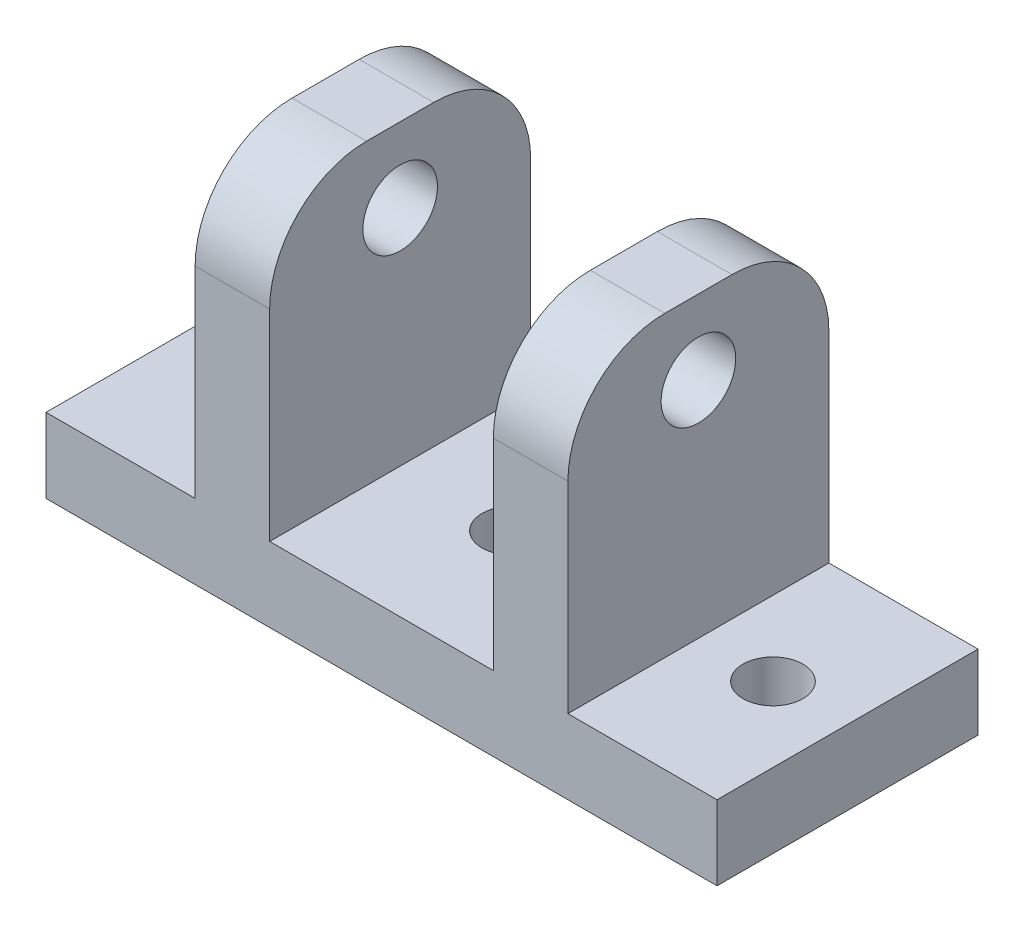
ISO-10303-21;
HEADER;
FILE_DESCRIPTION(('STEP AP214'),'2;1');
FILE_NAME('part.step','',(''),(''),'','','');
FILE_SCHEMA(('AUTOMOTIVE_DESIGN { 1 0 10303 214 1 1 1 1 }'));
ENDSEC;
DATA;
#1=APPLICATION_CONTEXT('core data for automotive mechanical design processes');
#2=APPLICATION_PROTOCOL_DEFINITION('international standard','automotive_design',2000,#1);
#3=PRODUCT_CONTEXT('',#1,'mechanical');
#4=PRODUCT('Part','Part','',(#3));
#5=PRODUCT_RELATED_PRODUCT_CATEGORY('part','',(#4));
#6=PRODUCT_DEFINITION_FORMATION('','',#4);
#7=PRODUCT_DEFINITION_CONTEXT('part definition',#1,'design');
#8=PRODUCT_DEFINITION('design','',#6,#7);
#9=PRODUCT_DEFINITION_SHAPE('','',#8);
#10=(LENGTH_UNIT() NAMED_UNIT(*) SI_UNIT(.MILLI.,.METRE.));
#11=(NAMED_UNIT(*) PLANE_ANGLE_UNIT() SI_UNIT($,.RADIAN.));
#12=(NAMED_UNIT(*) SI_UNIT($,.STERADIAN.) SOLID_ANGLE_UNIT());
#13=UNCERTAINTY_MEASURE_WITH_UNIT(LENGTH_MEASURE(1.E-05),#10,'distance_accuracy_value','');
#14=(GEOMETRIC_REPRESENTATION_CONTEXT(3) GLOBAL_UNCERTAINTY_ASSIGNED_CONTEXT((#13)) GLOBAL_UNIT_ASSIGNED_CONTEXT((#10,
#11,#12)) REPRESENTATION_CONTEXT('',''));
#15=CARTESIAN_POINT('',(0.,0.,0.));
#16=DIRECTION('',(0.,0.,1.));
#17=DIRECTION('',(1.,0.,0.));
#18=AXIS2_PLACEMENT_3D('',#15,#16,#17);
#19=CARTESIAN_POINT('',(0.,6.35,-22.225));
#20=DIRECTION('',(0.,0.,-1.));
#21=DIRECTION('',(-1.,0.,0.));
#22=AXIS2_PLACEMENT_3D('',#19,#20,#21);
#23=PLANE('',#22);
#24=DIRECTION('',(0.,-1.,0.));
#25=VECTOR('',#24,1.);
#26=CARTESIAN_POINT('',(12.7,31.75,-22.225));
#27=LINE('',#26,#25);
#28=CARTESIAN_POINT('',(12.7,23.495,-22.225));
#29=VERTEX_POINT('',#28);
#30=CARTESIAN_POINT('',(12.7,6.35,-22.225));
#31=VERTEX_POINT('',#30);
#32=EDGE_CURVE('E199',#29,#31,#27,.T.);
#33=ORIENTED_EDGE('',*,*,#32,.F.);
#34=DIRECTION('',(1.,0.,0.));
#35=VECTOR('',#34,1.);
#36=CARTESIAN_POINT('',(0.,23.495,-22.225));
#37=LINE('',#36,#35);
#38=CARTESIAN_POINT('',(19.05,23.495,-22.225));
#39=VERTEX_POINT('',#38);
#40=EDGE_CURVE('E260',#29,#39,#37,.T.);
#41=ORIENTED_EDGE('',*,*,#40,.T.);
#42=DIRECTION('',(0.,-1.,0.));
#43=VECTOR('',#42,1.);
#44=CARTESIAN_POINT('',(19.05,31.75,-22.225));
#45=LINE('',#44,#43);
#46=CARTESIAN_POINT('',(19.05,6.35,-22.225));
#47=VERTEX_POINT('',#46);
#48=EDGE_CURVE('E202',#39,#47,#45,.T.);
#49=ORIENTED_EDGE('',*,*,#48,.T.);
#50=DIRECTION('',(1.,0.,0.));
#51=VECTOR('',#50,1.);
#52=CARTESIAN_POINT('',(0.,6.35,-22.225));
#53=LINE('',#52,#51);
#54=CARTESIAN_POINT('',(38.1,6.35,-22.225));
#55=VERTEX_POINT('',#54);
#56=EDGE_CURVE('E243',#47,#55,#53,.T.);
#57=ORIENTED_EDGE('',*,*,#56,.T.);
#58=DIRECTION('',(0.,-1.,0.));
#59=VECTOR('',#58,1.);
#60=CARTESIAN_POINT('',(38.1,31.75,-22.225));
#61=LINE('',#60,#59);
#62=CARTESIAN_POINT('',(38.1,23.495,-22.225));
#63=VERTEX_POINT('',#62);
#64=EDGE_CURVE('E288',#63,#55,#61,.T.);
#65=ORIENTED_EDGE('',*,*,#64,.F.);
#66=DIRECTION('',(1.,0.,0.));
#67=VECTOR('',#66,1.);
#68=CARTESIAN_POINT('',(0.,23.495,-22.225));
#69=LINE('',#68,#67);
#70=CARTESIAN_POINT('',(44.45,23.495,-22.225));
#71=VERTEX_POINT('',#70);
#72=EDGE_CURVE('E321',#63,#71,#69,.T.);
#73=ORIENTED_EDGE('',*,*,#72,.T.);
#74=DIRECTION('',(0.,-1.,0.));
#75=VECTOR('',#74,1.);
#76=CARTESIAN_POINT('',(44.45,31.75,-22.225));
#77=LINE('',#76,#75);
#78=CARTESIAN_POINT('',(44.45,6.35,-22.225));
#79=VERTEX_POINT('',#78);
#80=EDGE_CURVE('E326',#71,#79,#77,.T.);
#81=ORIENTED_EDGE('',*,*,#80,.T.);
#82=DIRECTION('',(1.,0.,0.));
#83=VECTOR('',#82,1.);
#84=CARTESIAN_POINT('',(0.,6.35,-22.225));
#85=LINE('',#84,#83);
#86=CARTESIAN_POINT('',(57.15,6.35,-22.225));
#87=VERTEX_POINT('',#86);
#88=EDGE_CURVE('E166',#79,#87,#85,.T.);
#89=ORIENTED_EDGE('',*,*,#88,.T.);
#90=DIRECTION('',(0.,-1.,0.));
#91=VECTOR('',#90,1.);
#92=CARTESIAN_POINT('',(57.15,6.35,-22.225));
#93=LINE('',#92,#91);
#94=CARTESIAN_POINT('',(57.15,0.,-22.225));
#95=VERTEX_POINT('',#94);
#96=EDGE_CURVE('E174',#87,#95,#93,.T.);
#97=ORIENTED_EDGE('',*,*,#96,.T.);
#98=DIRECTION('',(1.,0.,0.));
#99=VECTOR('',#98,1.);
#100=CARTESIAN_POINT('',(0.,0.,-22.225));
#101=LINE('',#100,#99);
#102=CARTESIAN_POINT('',(0.,0.,-22.225));
#103=VERTEX_POINT('',#102);
#104=EDGE_CURVE('E219',#103,#95,#101,.T.);
#105=ORIENTED_EDGE('',*,*,#104,.F.);
#106=DIRECTION('',(0.,-1.,0.));
#107=VECTOR('',#106,1.);
#108=CARTESIAN_POINT('',(0.,6.35,-22.225));
#109=LINE('',#108,#107);
#110=CARTESIAN_POINT('',(0.,6.35,-22.225));
#111=VERTEX_POINT('',#110);
#112=EDGE_CURVE('E227',#111,#103,#109,.T.);
#113=ORIENTED_EDGE('',*,*,#112,.F.);
#114=DIRECTION('',(1.,0.,0.));
#115=VECTOR('',#114,1.);
#116=CARTESIAN_POINT('',(0.,6.35,-22.225));
#117=LINE('',#116,#115);
#118=EDGE_CURVE('E216',#111,#31,#117,.T.);
#119=ORIENTED_EDGE('',*,*,#118,.T.);
#120=EDGE_LOOP('',(#33,#41,#49,#57,#65,#73,#81,#89,#97,#105,#113,#119));
#121=FACE_BOUND('',#120,.T.);
#122=ADVANCED_FACE('F37',(#121),#23,.T.);
#123=CARTESIAN_POINT('',(0.,6.35,0.));
#124=DIRECTION('',(-1.,0.,0.));
#125=DIRECTION('',(0.,0.,1.));
#126=AXIS2_PLACEMENT_3D('',#123,#124,#125);
#127=PLANE('',#126);
#128=DIRECTION('',(0.,0.,-1.));
#129=VECTOR('',#128,1.);
#130=CARTESIAN_POINT('',(0.,0.,0.));
#131=LINE('',#130,#129);
#132=CARTESIAN_POINT('',(0.,0.,0.));
#133=VERTEX_POINT('',#132);
#134=EDGE_CURVE('E442',#133,#103,#131,.T.);
#135=ORIENTED_EDGE('',*,*,#134,.F.);
#136=DIRECTION('',(0.,-1.,0.));
#137=VECTOR('',#136,1.);
#138=CARTESIAN_POINT('',(0.,6.35,0.));
#139=LINE('',#138,#137);
#140=CARTESIAN_POINT('',(0.,6.35,0.));
#141=VERTEX_POINT('',#140);
#142=EDGE_CURVE('E226',#141,#133,#139,.T.);
#143=ORIENTED_EDGE('',*,*,#142,.F.);
#144=DIRECTION('',(0.,0.,-1.));
#145=VECTOR('',#144,1.);
#146=CARTESIAN_POINT('',(0.,6.35,0.));
#147=LINE('',#146,#145);
#148=EDGE_CURVE('E212',#141,#111,#147,.T.);
#149=ORIENTED_EDGE('',*,*,#148,.T.);
#150=ORIENTED_EDGE('',*,*,#112,.T.);
#151=EDGE_LOOP('',(#135,#143,#149,#150));
#152=FACE_BOUND('',#151,.T.);
#153=ADVANCED_FACE('F363',(#152),#127,.T.);
#154=CARTESIAN_POINT('',(0.,6.35,0.));
#155=DIRECTION('',(0.,0.,-1.));
#156=DIRECTION('',(-1.,0.,0.));
#157=AXIS2_PLACEMENT_3D('',#154,#155,#156);
#158=PLANE('',#157);
#159=DIRECTION('',(0.,-1.,0.));
#160=VECTOR('',#159,1.);
#161=CARTESIAN_POINT('',(44.45,31.75,0.));
#162=LINE('',#161,#160);
#163=CARTESIAN_POINT('',(44.45,23.495,0.));
#164=VERTEX_POINT('',#163);
#165=CARTESIAN_POINT('',(44.45,6.35,0.));
#166=VERTEX_POINT('',#165);
#167=EDGE_CURVE('E149',#164,#166,#162,.T.);
#168=ORIENTED_EDGE('',*,*,#167,.F.);
#169=DIRECTION('',(1.,0.,0.));
#170=VECTOR('',#169,1.);
#171=CARTESIAN_POINT('',(38.1,23.495,0.));
#172=LINE('',#171,#170);
#173=CARTESIAN_POINT('',(38.1,23.495,0.));
#174=VERTEX_POINT('',#173);
#175=EDGE_CURVE('E11',#164,#174,#172,.F.);
#176=ORIENTED_EDGE('',*,*,#175,.T.);
#177=DIRECTION('',(0.,-1.,0.));
#178=VECTOR('',#177,1.);
#179=CARTESIAN_POINT('',(38.1,31.75,0.));
#180=LINE('',#179,#178);
#181=CARTESIAN_POINT('',(38.1,6.35,0.));
#182=VERTEX_POINT('',#181);
#183=EDGE_CURVE('E158',#174,#182,#180,.T.);
#184=ORIENTED_EDGE('',*,*,#183,.T.);
#185=DIRECTION('',(1.,0.,0.));
#186=VECTOR('',#185,1.);
#187=CARTESIAN_POINT('',(0.,6.35,0.));
#188=LINE('',#187,#186);
#189=CARTESIAN_POINT('',(19.05,6.35,0.));
#190=VERTEX_POINT('',#189);
#191=EDGE_CURVE('E242',#190,#182,#188,.T.);
#192=ORIENTED_EDGE('',*,*,#191,.F.);
#193=DIRECTION('',(0.,-1.,0.));
#194=VECTOR('',#193,1.);
#195=CARTESIAN_POINT('',(19.05,31.75,0.));
#196=LINE('',#195,#194);
#197=CARTESIAN_POINT('',(19.05,23.495,0.));
#198=VERTEX_POINT('',#197);
#199=EDGE_CURVE('E255',#198,#190,#196,.T.);
#200=ORIENTED_EDGE('',*,*,#199,.F.);
#201=DIRECTION('',(1.,0.,0.));
#202=VECTOR('',#201,1.);
#203=CARTESIAN_POINT('',(12.7,23.495,0.));
#204=LINE('',#203,#202);
#205=CARTESIAN_POINT('',(12.7,23.495,0.));
#206=VERTEX_POINT('',#205);
#207=EDGE_CURVE('E45',#198,#206,#204,.F.);
#208=ORIENTED_EDGE('',*,*,#207,.T.);
#209=DIRECTION('',(0.,-1.,0.));
#210=VECTOR('',#209,1.);
#211=CARTESIAN_POINT('',(12.7,31.75,0.));
#212=LINE('',#211,#210);
#213=CARTESIAN_POINT('',(12.7,6.35,0.));
#214=VERTEX_POINT('',#213);
#215=EDGE_CURVE('E203',#206,#214,#212,.T.);
#216=ORIENTED_EDGE('',*,*,#215,.T.);
#217=DIRECTION('',(1.,0.,0.));
#218=VECTOR('',#217,1.);
#219=CARTESIAN_POINT('',(0.,6.35,0.));
#220=LINE('',#219,#218);
#221=EDGE_CURVE('E215',#141,#214,#220,.T.);
#222=ORIENTED_EDGE('',*,*,#221,.F.);
#223=ORIENTED_EDGE('',*,*,#142,.T.);
#224=DIRECTION('',(1.,0.,0.));
#225=VECTOR('',#224,1.);
#226=CARTESIAN_POINT('',(0.,0.,0.));
#227=LINE('',#226,#225);
#228=CARTESIAN_POINT('',(57.15,0.,0.));
#229=VERTEX_POINT('',#228);
#230=EDGE_CURVE('E235',#133,#229,#227,.T.);
#231=ORIENTED_EDGE('',*,*,#230,.T.);
#232=DIRECTION('',(0.,-1.,0.));
#233=VECTOR('',#232,1.);
#234=CARTESIAN_POINT('',(57.15,6.35,0.));
#235=LINE('',#234,#233);
#236=CARTESIAN_POINT('',(57.15,6.35,0.));
#237=VERTEX_POINT('',#236);
#238=EDGE_CURVE('E170',#237,#229,#235,.T.);
#239=ORIENTED_EDGE('',*,*,#238,.F.);
#240=DIRECTION('',(1.,0.,0.));
#241=VECTOR('',#240,1.);
#242=CARTESIAN_POINT('',(0.,6.35,0.));
#243=LINE('',#242,#241);
#244=EDGE_CURVE('E163',#166,#237,#243,.T.);
#245=ORIENTED_EDGE('',*,*,#244,.F.);
#246=EDGE_LOOP('',(#168,#176,#184,#192,#200,#208,#216,#222,#223,#231,#239,#245));
#247=FACE_BOUND('',#246,.T.);
#248=ADVANCED_FACE('F168',(#247),#158,.F.);
#249=CARTESIAN_POINT('',(0.,6.35,0.));
#250=DIRECTION('',(0.,1.,0.));
#251=DIRECTION('',(0.,0.,1.));
#252=AXIS2_PLACEMENT_3D('',#249,#250,#251);
#253=PLANE('',#252);
#254=CARTESIAN_POINT('',(6.35,6.35,-11.1125));
#255=DIRECTION('',(0.,1.,0.));
#256=DIRECTION('',(0.,0.,1.));
#257=AXIS2_PLACEMENT_3D('',#254,#255,#256);
#258=CIRCLE('',#257,2.55269999999999);
#259=CARTESIAN_POINT('',(6.35,6.35,-8.55980000000001));
#260=VERTEX_POINT('',#259);
#261=EDGE_CURVE('E198',#260,#260,#258,.T.);
#262=ORIENTED_EDGE('',*,*,#261,.F.);
#263=EDGE_LOOP('',(#262));
#264=FACE_BOUND('',#263,.T.);
#265=ORIENTED_EDGE('',*,*,#118,.F.);
#266=ORIENTED_EDGE('',*,*,#148,.F.);
#267=ORIENTED_EDGE('',*,*,#221,.T.);
#268=DIRECTION('',(0.,0.,1.));
#269=VECTOR('',#268,1.);
#270=CARTESIAN_POINT('',(12.7,6.35,0.));
#271=LINE('',#270,#269);
#272=EDGE_CURVE('E222',#31,#214,#271,.T.);
#273=ORIENTED_EDGE('',*,*,#272,.F.);
#274=EDGE_LOOP('',(#265,#266,#267,#273));
#275=FACE_BOUND('',#274,.T.);
#276=ADVANCED_FACE('F373',(#264,#275),#253,.T.);
#277=CARTESIAN_POINT('',(0.,0.,0.));
#278=DIRECTION('',(0.,1.,0.));
#279=DIRECTION('',(0.,0.,1.));
#280=AXIS2_PLACEMENT_3D('',#277,#278,#279);
#281=PLANE('',#280);
#282=CARTESIAN_POINT('',(6.35,0.,-11.1125));
#283=DIRECTION('',(0.,1.,0.));
#284=DIRECTION('',(0.,0.,1.));
#285=AXIS2_PLACEMENT_3D('',#282,#283,#284);
#286=CIRCLE('',#285,2.55269999999999);
#287=CARTESIAN_POINT('',(6.35,0.,-8.55980000000001));
#288=VERTEX_POINT('',#287);
#289=EDGE_CURVE('E195',#288,#288,#286,.T.);
#290=ORIENTED_EDGE('',*,*,#289,.T.);
#291=EDGE_LOOP('',(#290));
#292=FACE_BOUND('',#291,.T.);
#293=CARTESIAN_POINT('',(28.575,0.,-11.1125));
#294=DIRECTION('',(0.,1.,0.));
#295=DIRECTION('',(0.,0.,1.));
#296=AXIS2_PLACEMENT_3D('',#293,#294,#295);
#297=CIRCLE('',#296,2.55269999999999);
#298=CARTESIAN_POINT('',(28.575,0.,-8.55980000000001));
#299=VERTEX_POINT('',#298);
#300=EDGE_CURVE('E190',#299,#299,#297,.T.);
#301=ORIENTED_EDGE('',*,*,#300,.T.);
#302=EDGE_LOOP('',(#301));
#303=FACE_BOUND('',#302,.T.);
#304=CARTESIAN_POINT('',(50.8,0.,-11.1125));
#305=DIRECTION('',(0.,1.,0.));
#306=DIRECTION('',(0.,0.,1.));
#307=AXIS2_PLACEMENT_3D('',#304,#305,#306);
#308=CIRCLE('',#307,2.55269999999999);
#309=CARTESIAN_POINT('',(50.8,0.,-8.55980000000001));
#310=VERTEX_POINT('',#309);
#311=EDGE_CURVE('E434',#310,#310,#308,.T.);
#312=ORIENTED_EDGE('',*,*,#311,.T.);
#313=EDGE_LOOP('',(#312));
#314=FACE_BOUND('',#313,.T.);
#315=ORIENTED_EDGE('',*,*,#104,.T.);
#316=DIRECTION('',(0.,0.,-1.));
#317=VECTOR('',#316,1.);
#318=CARTESIAN_POINT('',(57.15,0.,0.));
#319=LINE('',#318,#317);
#320=EDGE_CURVE('E182',#229,#95,#319,.T.);
#321=ORIENTED_EDGE('',*,*,#320,.F.);
#322=ORIENTED_EDGE('',*,*,#230,.F.);
#323=ORIENTED_EDGE('',*,*,#134,.T.);
#324=EDGE_LOOP('',(#315,#321,#322,#323));
#325=FACE_BOUND('',#324,.T.);
#326=ADVANCED_FACE('F374',(#292,#303,#314,#325),#281,.F.);
#327=CARTESIAN_POINT('',(12.7,31.75,0.));
#328=DIRECTION('',(1.,0.,0.));
#329=DIRECTION('',(0.,0.,-1.));
#330=AXIS2_PLACEMENT_3D('',#327,#328,#329);
#331=PLANE('',#330);
#332=CARTESIAN_POINT('',(12.7,25.4,-11.1125));
#333=DIRECTION('',(-1.,0.,0.));
#334=DIRECTION('',(0.,0.,1.));
#335=AXIS2_PLACEMENT_3D('',#332,#333,#334);
#336=CIRCLE('',#335,3.175);
#337=CARTESIAN_POINT('',(12.7,25.4,-7.9375));
#338=VERTEX_POINT('',#337);
#339=EDGE_CURVE('E189',#338,#338,#336,.T.);
#340=ORIENTED_EDGE('',*,*,#339,.F.);
#341=EDGE_LOOP('',(#340));
#342=FACE_BOUND('',#341,.T.);
#343=DIRECTION('',(0.,0.,1.));
#344=VECTOR('',#343,1.);
#345=CARTESIAN_POINT('',(12.7,31.75,0.));
#346=LINE('',#345,#344);
#347=CARTESIAN_POINT('',(12.7,31.75,-13.97));
#348=VERTEX_POINT('',#347);
#349=CARTESIAN_POINT('',(12.7,31.75,-8.255));
#350=VERTEX_POINT('',#349);
#351=EDGE_CURVE('E253',#348,#350,#346,.T.);
#352=ORIENTED_EDGE('',*,*,#351,.F.);
#353=CARTESIAN_POINT('',(12.7,23.495,-13.97));
#354=DIRECTION('',(1.,0.,0.));
#355=DIRECTION('',(0.,0.,-1.));
#356=AXIS2_PLACEMENT_3D('',#353,#354,#355);
#357=CIRCLE('',#356,8.255);
#358=EDGE_CURVE('E274',#348,#29,#357,.F.);
#359=ORIENTED_EDGE('',*,*,#358,.T.);
#360=ORIENTED_EDGE('',*,*,#32,.T.);
#361=ORIENTED_EDGE('',*,*,#272,.T.);
#362=ORIENTED_EDGE('',*,*,#215,.F.);
#363=CARTESIAN_POINT('',(12.7,23.495,-8.255));
#364=DIRECTION('',(1.,0.,0.));
#365=DIRECTION('',(0.,0.,-1.));
#366=AXIS2_PLACEMENT_3D('',#363,#364,#365);
#367=CIRCLE('',#366,8.255);
#368=EDGE_CURVE('E271',#206,#350,#367,.F.);
#369=ORIENTED_EDGE('',*,*,#368,.T.);
#370=EDGE_LOOP('',(#352,#359,#360,#361,#362,#369));
#371=FACE_BOUND('',#370,.T.);
#372=ADVANCED_FACE('F302',(#342,#371),#331,.F.);
#373=CARTESIAN_POINT('',(19.05,31.75,0.));
#374=DIRECTION('',(1.,0.,0.));
#375=DIRECTION('',(0.,0.,-1.));
#376=AXIS2_PLACEMENT_3D('',#373,#374,#375);
#377=PLANE('',#376);
#378=CARTESIAN_POINT('',(19.05,25.4,-11.1125));
#379=DIRECTION('',(1.,0.,0.));
#380=DIRECTION('',(0.,0.,-1.));
#381=AXIS2_PLACEMENT_3D('',#378,#379,#380);
#382=CIRCLE('',#381,3.175);
#383=CARTESIAN_POINT('',(19.05,25.4,-14.2875));
#384=VERTEX_POINT('',#383);
#385=EDGE_CURVE('E445',#384,#384,#382,.T.);
#386=ORIENTED_EDGE('',*,*,#385,.F.);
#387=EDGE_LOOP('',(#386));
#388=FACE_BOUND('',#387,.T.);
#389=ORIENTED_EDGE('',*,*,#48,.F.);
#390=CARTESIAN_POINT('',(19.05,23.495,-13.97));
#391=DIRECTION('',(1.,0.,0.));
#392=DIRECTION('',(0.,0.,-1.));
#393=AXIS2_PLACEMENT_3D('',#390,#391,#392);
#394=CIRCLE('',#393,8.255);
#395=CARTESIAN_POINT('',(19.05,31.75,-13.97));
#396=VERTEX_POINT('',#395);
#397=EDGE_CURVE('E264',#39,#396,#394,.T.);
#398=ORIENTED_EDGE('',*,*,#397,.T.);
#399=DIRECTION('',(0.,0.,1.));
#400=VECTOR('',#399,1.);
#401=CARTESIAN_POINT('',(19.05,31.75,0.));
#402=LINE('',#401,#400);
#403=CARTESIAN_POINT('',(19.05,31.75,-8.255));
#404=VERTEX_POINT('',#403);
#405=EDGE_CURVE('E250',#396,#404,#402,.T.);
#406=ORIENTED_EDGE('',*,*,#405,.T.);
#407=CARTESIAN_POINT('',(19.05,23.495,-8.255));
#408=DIRECTION('',(1.,0.,0.));
#409=DIRECTION('',(0.,0.,-1.));
#410=AXIS2_PLACEMENT_3D('',#407,#408,#409);
#411=CIRCLE('',#410,8.255);
#412=EDGE_CURVE('E262',#404,#198,#411,.T.);
#413=ORIENTED_EDGE('',*,*,#412,.T.);
#414=ORIENTED_EDGE('',*,*,#199,.T.);
#415=DIRECTION('',(0.,0.,1.));
#416=VECTOR('',#415,1.);
#417=CARTESIAN_POINT('',(19.05,6.35,0.));
#418=LINE('',#417,#416);
#419=EDGE_CURVE('E238',#47,#190,#418,.T.);
#420=ORIENTED_EDGE('',*,*,#419,.F.);
#421=EDGE_LOOP('',(#389,#398,#406,#413,#414,#420));
#422=FACE_BOUND('',#421,.T.);
#423=ADVANCED_FACE('F311',(#388,#422),#377,.T.);
#424=CARTESIAN_POINT('',(0.,31.75,0.));
#425=DIRECTION('',(0.,1.,0.));
#426=DIRECTION('',(0.,0.,1.));
#427=AXIS2_PLACEMENT_3D('',#424,#425,#426);
#428=PLANE('',#427);
#429=ORIENTED_EDGE('',*,*,#405,.F.);
#430=DIRECTION('',(1.,0.,0.));
#431=VECTOR('',#430,1.);
#432=CARTESIAN_POINT('',(0.,31.75,-13.97));
#433=LINE('',#432,#431);
#434=EDGE_CURVE('E269',#396,#348,#433,.F.);
#435=ORIENTED_EDGE('',*,*,#434,.T.);
#436=ORIENTED_EDGE('',*,*,#351,.T.);
#437=DIRECTION('',(1.,0.,0.));
#438=VECTOR('',#437,1.);
#439=CARTESIAN_POINT('',(19.05,31.75,-8.255));
#440=LINE('',#439,#438);
#441=EDGE_CURVE('E266',#350,#404,#440,.T.);
#442=ORIENTED_EDGE('',*,*,#441,.T.);
#443=EDGE_LOOP('',(#429,#435,#436,#442));
#444=FACE_BOUND('',#443,.T.);
#445=ADVANCED_FACE('F307',(#444),#428,.T.);
#446=CARTESIAN_POINT('',(0.,6.35,0.));
#447=DIRECTION('',(0.,1.,0.));
#448=DIRECTION('',(0.,0.,1.));
#449=AXIS2_PLACEMENT_3D('',#446,#447,#448);
#450=PLANE('',#449);
#451=CARTESIAN_POINT('',(28.575,6.35,-11.1125));
#452=DIRECTION('',(0.,1.,0.));
#453=DIRECTION('',(0.,0.,1.));
#454=AXIS2_PLACEMENT_3D('',#451,#452,#453);
#455=CIRCLE('',#454,2.55269999999999);
#456=CARTESIAN_POINT('',(28.575,6.35,-8.55980000000001));
#457=VERTEX_POINT('',#456);
#458=EDGE_CURVE('E194',#457,#457,#455,.T.);
#459=ORIENTED_EDGE('',*,*,#458,.F.);
#460=EDGE_LOOP('',(#459));
#461=FACE_BOUND('',#460,.T.);
#462=DIRECTION('',(0.,0.,1.));
#463=VECTOR('',#462,1.);
#464=CARTESIAN_POINT('',(38.1,6.35,0.));
#465=LINE('',#464,#463);
#466=EDGE_CURVE('E327',#55,#182,#465,.T.);
#467=ORIENTED_EDGE('',*,*,#466,.F.);
#468=ORIENTED_EDGE('',*,*,#56,.F.);
#469=ORIENTED_EDGE('',*,*,#419,.T.);
#470=ORIENTED_EDGE('',*,*,#191,.T.);
#471=EDGE_LOOP('',(#467,#468,#469,#470));
#472=FACE_BOUND('',#471,.T.);
#473=ADVANCED_FACE('F336',(#461,#472),#450,.T.);
#474=CARTESIAN_POINT('',(38.1,31.75,0.));
#475=DIRECTION('',(1.,0.,0.));
#476=DIRECTION('',(0.,0.,-1.));
#477=AXIS2_PLACEMENT_3D('',#474,#475,#476);
#478=PLANE('',#477);
#479=CARTESIAN_POINT('',(38.1,25.4,-11.1125));
#480=DIRECTION('',(1.,0.,0.));
#481=DIRECTION('',(0.,0.,-1.));
#482=AXIS2_PLACEMENT_3D('',#479,#480,#481);
#483=CIRCLE('',#482,3.175);
#484=CARTESIAN_POINT('',(38.1,25.4,-14.2875));
#485=VERTEX_POINT('',#484);
#486=EDGE_CURVE('E188',#485,#485,#483,.T.);
#487=ORIENTED_EDGE('',*,*,#486,.T.);
#488=EDGE_LOOP('',(#487));
#489=FACE_BOUND('',#488,.T.);
#490=DIRECTION('',(0.,0.,1.));
#491=VECTOR('',#490,1.);
#492=CARTESIAN_POINT('',(38.1,31.75,0.));
#493=LINE('',#492,#491);
#494=CARTESIAN_POINT('',(38.1,31.75,-13.97));
#495=VERTEX_POINT('',#494);
#496=CARTESIAN_POINT('',(38.1,31.75,-8.255));
#497=VERTEX_POINT('',#496);
#498=EDGE_CURVE('E159',#495,#497,#493,.T.);
#499=ORIENTED_EDGE('',*,*,#498,.F.);
#500=CARTESIAN_POINT('',(38.1,23.495,-13.97));
#501=DIRECTION('',(1.,0.,0.));
#502=DIRECTION('',(0.,0.,-1.));
#503=AXIS2_PLACEMENT_3D('',#500,#501,#502);
#504=CIRCLE('',#503,8.255);
#505=EDGE_CURVE('E292',#495,#63,#504,.F.);
#506=ORIENTED_EDGE('',*,*,#505,.T.);
#507=ORIENTED_EDGE('',*,*,#64,.T.);
#508=ORIENTED_EDGE('',*,*,#466,.T.);
#509=ORIENTED_EDGE('',*,*,#183,.F.);
#510=CARTESIAN_POINT('',(38.1,23.495,-8.255));
#511=DIRECTION('',(1.,0.,0.));
#512=DIRECTION('',(0.,0.,-1.));
#513=AXIS2_PLACEMENT_3D('',#510,#511,#512);
#514=CIRCLE('',#513,8.255);
#515=EDGE_CURVE('E57',#174,#497,#514,.F.);
#516=ORIENTED_EDGE('',*,*,#515,.T.);
#517=EDGE_LOOP('',(#499,#506,#507,#508,#509,#516));
#518=FACE_BOUND('',#517,.T.);
#519=ADVANCED_FACE('F331',(#489,#518),#478,.F.);
#520=CARTESIAN_POINT('',(44.45,31.75,0.));
#521=DIRECTION('',(1.,0.,0.));
#522=DIRECTION('',(0.,0.,-1.));
#523=AXIS2_PLACEMENT_3D('',#520,#521,#522);
#524=PLANE('',#523);
#525=CARTESIAN_POINT('',(44.45,25.4,-11.1125));
#526=DIRECTION('',(1.,0.,0.));
#527=DIRECTION('',(0.,0.,-1.));
#528=AXIS2_PLACEMENT_3D('',#525,#526,#527);
#529=CIRCLE('',#528,3.175);
#530=CARTESIAN_POINT('',(44.45,25.4,-14.2875));
#531=VERTEX_POINT('',#530);
#532=EDGE_CURVE('E185',#531,#531,#529,.T.);
#533=ORIENTED_EDGE('',*,*,#532,.F.);
#534=EDGE_LOOP('',(#533));
#535=FACE_BOUND('',#534,.T.);
#536=ORIENTED_EDGE('',*,*,#80,.F.);
#537=CARTESIAN_POINT('',(44.45,23.495,-13.97));
#538=DIRECTION('',(1.,0.,0.));
#539=DIRECTION('',(0.,0.,-1.));
#540=AXIS2_PLACEMENT_3D('',#537,#538,#539);
#541=CIRCLE('',#540,8.255);
#542=CARTESIAN_POINT('',(44.45,31.75,-13.97));
#543=VERTEX_POINT('',#542);
#544=EDGE_CURVE('E348',#71,#543,#541,.T.);
#545=ORIENTED_EDGE('',*,*,#544,.T.);
#546=DIRECTION('',(0.,0.,1.));
#547=VECTOR('',#546,1.);
#548=CARTESIAN_POINT('',(44.45,31.75,0.));
#549=LINE('',#548,#547);
#550=CARTESIAN_POINT('',(44.45,31.75,-8.255));
#551=VERTEX_POINT('',#550);
#552=EDGE_CURVE('E349',#543,#551,#549,.T.);
#553=ORIENTED_EDGE('',*,*,#552,.T.);
#554=CARTESIAN_POINT('',(44.45,23.495,-8.255));
#555=DIRECTION('',(1.,0.,0.));
#556=DIRECTION('',(0.,0.,-1.));
#557=AXIS2_PLACEMENT_3D('',#554,#555,#556);
#558=CIRCLE('',#557,8.255);
#559=EDGE_CURVE('E156',#551,#164,#558,.T.);
#560=ORIENTED_EDGE('',*,*,#559,.T.);
#561=ORIENTED_EDGE('',*,*,#167,.T.);
#562=DIRECTION('',(0.,0.,1.));
#563=VECTOR('',#562,1.);
#564=CARTESIAN_POINT('',(44.45,6.35,0.));
#565=LINE('',#564,#563);
#566=EDGE_CURVE('E153',#79,#166,#565,.T.);
#567=ORIENTED_EDGE('',*,*,#566,.F.);
#568=EDGE_LOOP('',(#536,#545,#553,#560,#561,#567));
#569=FACE_BOUND('',#568,.T.);
#570=ADVANCED_FACE('F152',(#535,#569),#524,.T.);
#571=CARTESIAN_POINT('',(0.,31.75,0.));
#572=DIRECTION('',(0.,1.,0.));
#573=DIRECTION('',(0.,0.,1.));
#574=AXIS2_PLACEMENT_3D('',#571,#572,#573);
#575=PLANE('',#574);
#576=ORIENTED_EDGE('',*,*,#552,.F.);
#577=DIRECTION('',(1.,0.,0.));
#578=VECTOR('',#577,1.);
#579=CARTESIAN_POINT('',(0.,31.75,-13.97));
#580=LINE('',#579,#578);
#581=EDGE_CURVE('E289',#543,#495,#580,.F.);
#582=ORIENTED_EDGE('',*,*,#581,.T.);
#583=ORIENTED_EDGE('',*,*,#498,.T.);
#584=DIRECTION('',(1.,0.,0.));
#585=VECTOR('',#584,1.);
#586=CARTESIAN_POINT('',(44.45,31.75,-8.255));
#587=LINE('',#586,#585);
#588=EDGE_CURVE('E345',#497,#551,#587,.T.);
#589=ORIENTED_EDGE('',*,*,#588,.T.);
#590=EDGE_LOOP('',(#576,#582,#583,#589));
#591=FACE_BOUND('',#590,.T.);
#592=ADVANCED_FACE('F352',(#591),#575,.T.);
#593=CARTESIAN_POINT('',(57.15,6.35,0.));
#594=DIRECTION('',(-1.,0.,0.));
#595=DIRECTION('',(0.,0.,1.));
#596=AXIS2_PLACEMENT_3D('',#593,#594,#595);
#597=PLANE('',#596);
#598=ORIENTED_EDGE('',*,*,#320,.T.);
#599=ORIENTED_EDGE('',*,*,#96,.F.);
#600=DIRECTION('',(0.,0.,-1.));
#601=VECTOR('',#600,1.);
#602=CARTESIAN_POINT('',(57.15,6.35,0.));
#603=LINE('',#602,#601);
#604=EDGE_CURVE('E172',#237,#87,#603,.T.);
#605=ORIENTED_EDGE('',*,*,#604,.F.);
#606=ORIENTED_EDGE('',*,*,#238,.T.);
#607=EDGE_LOOP('',(#598,#599,#605,#606));
#608=FACE_BOUND('',#607,.T.);
#609=ADVANCED_FACE('F400',(#608),#597,.F.);
#610=CARTESIAN_POINT('',(0.,6.35,0.));
#611=DIRECTION('',(0.,1.,0.));
#612=DIRECTION('',(0.,0.,1.));
#613=AXIS2_PLACEMENT_3D('',#610,#611,#612);
#614=PLANE('',#613);
#615=CARTESIAN_POINT('',(50.8,6.35,-11.1125));
#616=DIRECTION('',(0.,1.,0.));
#617=DIRECTION('',(0.,0.,1.));
#618=AXIS2_PLACEMENT_3D('',#615,#616,#617);
#619=CIRCLE('',#618,2.55269999999999);
#620=CARTESIAN_POINT('',(50.8,6.35,-8.55980000000001));
#621=VERTEX_POINT('',#620);
#622=EDGE_CURVE('E193',#621,#621,#619,.T.);
#623=ORIENTED_EDGE('',*,*,#622,.F.);
#624=EDGE_LOOP('',(#623));
#625=FACE_BOUND('',#624,.T.);
#626=ORIENTED_EDGE('',*,*,#88,.F.);
#627=ORIENTED_EDGE('',*,*,#566,.T.);
#628=ORIENTED_EDGE('',*,*,#244,.T.);
#629=ORIENTED_EDGE('',*,*,#604,.T.);
#630=EDGE_LOOP('',(#626,#627,#628,#629));
#631=FACE_BOUND('',#630,.T.);
#632=ADVANCED_FACE('F162',(#625,#631),#614,.T.);
#633=CARTESIAN_POINT('',(57.150025,25.4,-11.1125));
#634=DIRECTION('',(-1.,0.,0.));
#635=DIRECTION('',(0.,0.,1.));
#636=AXIS2_PLACEMENT_3D('',#633,#634,#635);
#637=CYLINDRICAL_SURFACE('',#636,3.175);
#638=ORIENTED_EDGE('',*,*,#532,.T.);
#639=EDGE_LOOP('',(#638));
#640=FACE_BOUND('',#639,.T.);
#641=ORIENTED_EDGE('',*,*,#486,.F.);
#642=EDGE_LOOP('',(#641));
#643=FACE_BOUND('',#642,.T.);
#644=ADVANCED_FACE('F406',(#640,#643),#637,.F.);
#645=ORIENTED_EDGE('',*,*,#385,.T.);
#646=EDGE_LOOP('',(#645));
#647=FACE_BOUND('',#646,.T.);
#648=ORIENTED_EDGE('',*,*,#339,.T.);
#649=EDGE_LOOP('',(#648));
#650=FACE_BOUND('',#649,.T.);
#651=ADVANCED_FACE('F408',(#647,#650),#637,.F.);
#652=CARTESIAN_POINT('',(50.8,6.35,-11.1125));
#653=DIRECTION('',(0.,1.,0.));
#654=DIRECTION('',(0.,0.,1.));
#655=AXIS2_PLACEMENT_3D('',#652,#653,#654);
#656=CYLINDRICAL_SURFACE('',#655,2.55269999999999);
#657=ORIENTED_EDGE('',*,*,#622,.T.);
#658=EDGE_LOOP('',(#657));
#659=FACE_BOUND('',#658,.T.);
#660=ORIENTED_EDGE('',*,*,#311,.F.);
#661=EDGE_LOOP('',(#660));
#662=FACE_BOUND('',#661,.T.);
#663=ADVANCED_FACE('F411',(#659,#662),#656,.F.);
#664=CARTESIAN_POINT('',(28.575,6.35,-11.1125));
#665=DIRECTION('',(0.,1.,0.));
#666=DIRECTION('',(0.,0.,1.));
#667=AXIS2_PLACEMENT_3D('',#664,#665,#666);
#668=CYLINDRICAL_SURFACE('',#667,2.55269999999999);
#669=ORIENTED_EDGE('',*,*,#458,.T.);
#670=EDGE_LOOP('',(#669));
#671=FACE_BOUND('',#670,.T.);
#672=ORIENTED_EDGE('',*,*,#300,.F.);
#673=EDGE_LOOP('',(#672));
#674=FACE_BOUND('',#673,.T.);
#675=ADVANCED_FACE('F415',(#671,#674),#668,.F.);
#676=CARTESIAN_POINT('',(6.35,6.35,-11.1125));
#677=DIRECTION('',(0.,1.,0.));
#678=DIRECTION('',(0.,0.,1.));
#679=AXIS2_PLACEMENT_3D('',#676,#677,#678);
#680=CYLINDRICAL_SURFACE('',#679,2.55269999999999);
#681=ORIENTED_EDGE('',*,*,#261,.T.);
#682=EDGE_LOOP('',(#681));
#683=FACE_BOUND('',#682,.T.);
#684=ORIENTED_EDGE('',*,*,#289,.F.);
#685=EDGE_LOOP('',(#684));
#686=FACE_BOUND('',#685,.T.);
#687=ADVANCED_FACE('F360',(#683,#686),#680,.F.);
#688=CARTESIAN_POINT('',(0.,23.495,-13.97));
#689=DIRECTION('',(1.,0.,0.));
#690=DIRECTION('',(0.,0.,-1.));
#691=AXIS2_PLACEMENT_3D('',#688,#689,#690);
#692=CYLINDRICAL_SURFACE('',#691,8.255);
#693=ORIENTED_EDGE('',*,*,#358,.F.);
#694=ORIENTED_EDGE('',*,*,#434,.F.);
#695=ORIENTED_EDGE('',*,*,#397,.F.);
#696=ORIENTED_EDGE('',*,*,#40,.F.);
#697=EDGE_LOOP('',(#693,#694,#695,#696));
#698=FACE_BOUND('',#697,.T.);
#699=ADVANCED_FACE('F317',(#698),#692,.T.);
#700=CARTESIAN_POINT('',(0.,23.495,-13.97));
#701=DIRECTION('',(1.,0.,0.));
#702=DIRECTION('',(0.,0.,-1.));
#703=AXIS2_PLACEMENT_3D('',#700,#701,#702);
#704=CYLINDRICAL_SURFACE('',#703,8.255);
#705=ORIENTED_EDGE('',*,*,#505,.F.);
#706=ORIENTED_EDGE('',*,*,#581,.F.);
#707=ORIENTED_EDGE('',*,*,#544,.F.);
#708=ORIENTED_EDGE('',*,*,#72,.F.);
#709=EDGE_LOOP('',(#705,#706,#707,#708));
#710=FACE_BOUND('',#709,.T.);
#711=ADVANCED_FACE('F353',(#710),#704,.T.);
#712=CARTESIAN_POINT('',(0.,23.495,-8.255));
#713=DIRECTION('',(-1.,0.,0.));
#714=DIRECTION('',(0.,0.,1.));
#715=AXIS2_PLACEMENT_3D('',#712,#713,#714);
#716=CYLINDRICAL_SURFACE('',#715,8.255);
#717=ORIENTED_EDGE('',*,*,#515,.F.);
#718=ORIENTED_EDGE('',*,*,#175,.F.);
#719=ORIENTED_EDGE('',*,*,#559,.F.);
#720=ORIENTED_EDGE('',*,*,#588,.F.);
#721=EDGE_LOOP('',(#717,#718,#719,#720));
#722=FACE_BOUND('',#721,.T.);
#723=ADVANCED_FACE('F343',(#722),#716,.T.);
#724=CARTESIAN_POINT('',(0.,23.495,-8.255));
#725=DIRECTION('',(-1.,0.,0.));
#726=DIRECTION('',(0.,0.,1.));
#727=AXIS2_PLACEMENT_3D('',#724,#725,#726);
#728=CYLINDRICAL_SURFACE('',#727,8.255);
#729=ORIENTED_EDGE('',*,*,#368,.F.);
#730=ORIENTED_EDGE('',*,*,#207,.F.);
#731=ORIENTED_EDGE('',*,*,#412,.F.);
#732=ORIENTED_EDGE('',*,*,#441,.F.);
#733=EDGE_LOOP('',(#729,#730,#731,#732));
#734=FACE_BOUND('',#733,.T.);
#735=ADVANCED_FACE('F39',(#734),#728,.T.);
#736=CLOSED_SHELL('',(#122,#153,#248,#276,#326,#372,#423,#445,#473,#519,#570,#592,#609,#632,
#644,#651,#663,#675,#687,#699,#711,#723,#735));
#737=MANIFOLD_SOLID_BREP('B2',#736);
#738=ADVANCED_BREP_SHAPE_REPRESENTATION('',(#18,#737),#14);
#739=SHAPE_DEFINITION_REPRESENTATION(#9,#738);
ENDSEC;
END-ISO-10303-21;
